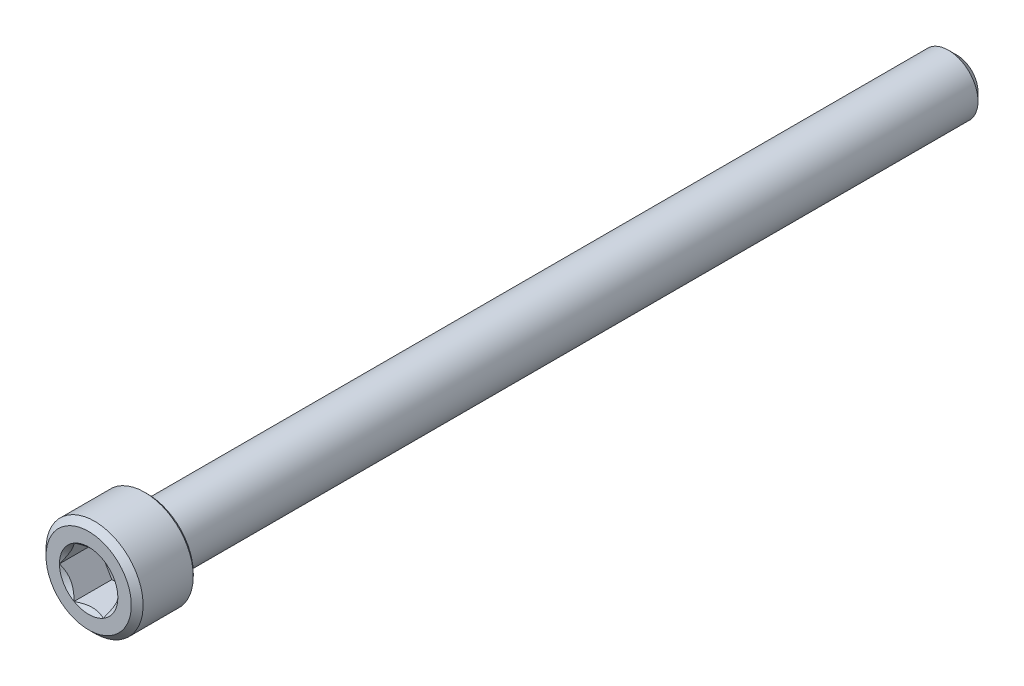
ISO-10303-21;
HEADER;
FILE_DESCRIPTION(('STEP AP214'),'2;1');
FILE_NAME('part.step','',(''),(''),'','','');
FILE_SCHEMA(('AUTOMOTIVE_DESIGN { 1 0 10303 214 1 1 1 1 }'));
ENDSEC;
DATA;
#1=APPLICATION_CONTEXT('core data for automotive mechanical design processes');
#2=APPLICATION_PROTOCOL_DEFINITION('international standard','automotive_design',2000,#1);
#3=PRODUCT_CONTEXT('',#1,'mechanical');
#4=PRODUCT('Part','Part','',(#3));
#5=PRODUCT_RELATED_PRODUCT_CATEGORY('part','',(#4));
#6=PRODUCT_DEFINITION_FORMATION('','',#4);
#7=PRODUCT_DEFINITION_CONTEXT('part definition',#1,'design');
#8=PRODUCT_DEFINITION('design','',#6,#7);
#9=PRODUCT_DEFINITION_SHAPE('','',#8);
#10=(LENGTH_UNIT() NAMED_UNIT(*) SI_UNIT(.MILLI.,.METRE.));
#11=(NAMED_UNIT(*) PLANE_ANGLE_UNIT() SI_UNIT($,.RADIAN.));
#12=(NAMED_UNIT(*) SI_UNIT($,.STERADIAN.) SOLID_ANGLE_UNIT());
#13=UNCERTAINTY_MEASURE_WITH_UNIT(LENGTH_MEASURE(1.E-05),#10,'distance_accuracy_value','');
#14=(GEOMETRIC_REPRESENTATION_CONTEXT(3) GLOBAL_UNCERTAINTY_ASSIGNED_CONTEXT((#13)) GLOBAL_UNIT_ASSIGNED_CONTEXT((#10,
#11,#12)) REPRESENTATION_CONTEXT('',''));
#15=CARTESIAN_POINT('',(0.,0.,0.));
#16=DIRECTION('',(0.,0.,1.));
#17=DIRECTION('',(1.,0.,0.));
#18=AXIS2_PLACEMENT_3D('',#15,#16,#17);
#19=CARTESIAN_POINT('',(0.,0.,58.6486));
#20=DIRECTION('',(0.,0.,1.));
#21=DIRECTION('',(1.,0.,0.));
#22=AXIS2_PLACEMENT_3D('',#19,#20,#21);
#23=PLANE('',#22);
#24=DIRECTION('',(0.5,-0.866025403784438,0.));
#25=VECTOR('',#24,1.);
#26=CARTESIAN_POINT('',(-2.06185637534076,0.,58.6486));
#27=LINE('',#26,#25);
#28=CARTESIAN_POINT('',(-2.06185637534076,0.,58.6486));
#29=VERTEX_POINT('',#28);
#30=CARTESIAN_POINT('',(-1.03092818767038,-1.78562,58.6486));
#31=VERTEX_POINT('',#30);
#32=EDGE_CURVE('E137',#29,#31,#27,.T.);
#33=ORIENTED_EDGE('',*,*,#32,.T.);
#34=DIRECTION('',(1.,0.,0.));
#35=VECTOR('',#34,1.);
#36=CARTESIAN_POINT('',(-1.03092818767038,-1.78562,58.6486));
#37=LINE('',#36,#35);
#38=CARTESIAN_POINT('',(1.03092818767038,-1.78562,58.6486));
#39=VERTEX_POINT('',#38);
#40=EDGE_CURVE('E97',#31,#39,#37,.T.);
#41=ORIENTED_EDGE('',*,*,#40,.T.);
#42=DIRECTION('',(0.5,0.866025403784439,0.));
#43=VECTOR('',#42,1.);
#44=CARTESIAN_POINT('',(1.03092818767038,-1.78562,58.6486));
#45=LINE('',#44,#43);
#46=CARTESIAN_POINT('',(2.06185637534076,0.,58.6486));
#47=VERTEX_POINT('',#46);
#48=EDGE_CURVE('E99',#39,#47,#45,.T.);
#49=ORIENTED_EDGE('',*,*,#48,.T.);
#50=DIRECTION('',(-0.5,0.866025403784439,0.));
#51=VECTOR('',#50,1.);
#52=CARTESIAN_POINT('',(2.06185637534076,0.,58.6486));
#53=LINE('',#52,#51);
#54=CARTESIAN_POINT('',(1.03092818767038,1.78562,58.6486));
#55=VERTEX_POINT('',#54);
#56=EDGE_CURVE('E100',#47,#55,#53,.T.);
#57=ORIENTED_EDGE('',*,*,#56,.T.);
#58=DIRECTION('',(-1.,0.,0.));
#59=VECTOR('',#58,1.);
#60=CARTESIAN_POINT('',(1.03092818767038,1.78562,58.6486));
#61=LINE('',#60,#59);
#62=CARTESIAN_POINT('',(-1.03092818767038,1.78562,58.6486));
#63=VERTEX_POINT('',#62);
#64=EDGE_CURVE('E82',#55,#63,#61,.T.);
#65=ORIENTED_EDGE('',*,*,#64,.T.);
#66=DIRECTION('',(-0.5,-0.866025403784439,0.));
#67=VECTOR('',#66,1.);
#68=CARTESIAN_POINT('',(-1.03092818767038,1.78562,58.6486));
#69=LINE('',#68,#67);
#70=EDGE_CURVE('E131',#63,#29,#69,.T.);
#71=ORIENTED_EDGE('',*,*,#70,.T.);
#72=EDGE_LOOP('',(#33,#41,#49,#57,#65,#71));
#73=FACE_BOUND('',#72,.T.);
#74=ADVANCED_FACE('F17',(#73),#23,.T.);
#75=CARTESIAN_POINT('',(2.06185637534076,0.,58.6486));
#76=DIRECTION('',(0.866025403784439,0.5,0.));
#77=DIRECTION('',(-0.5,0.866025403784439,0.));
#78=AXIS2_PLACEMENT_3D('',#75,#76,#77);
#79=PLANE('',#78);
#80=CARTESIAN_POINT('',(2.06185637532686,2.46058809715619E-11,61.315600000035));
#81=CARTESIAN_POINT('',(2.02642287006139,0.0613726314343141,61.2802004995492));
#82=CARTESIAN_POINT('',(1.99039691582119,0.123771414569363,61.2468804146496));
#83=CARTESIAN_POINT('',(1.91693629806115,0.251008936885034,61.1858727616442));
#84=CARTESIAN_POINT('',(1.8794946522501,0.315859769748806,61.1582191270846));
#85=CARTESIAN_POINT('',(1.80399541009906,0.446628293087391,61.1108482649396));
#86=CARTESIAN_POINT('',(1.76595703077494,0.512512698714332,61.091012004616));
#87=CARTESIAN_POINT('',(1.68904308953308,0.645731552755586,61.06045046778));
#88=CARTESIAN_POINT('',(1.65016987553725,0.713061934449866,61.0497023867868));
#89=CARTESIAN_POINT('',(1.58317010137488,0.829108947394733,61.0400045880717));
#90=CARTESIAN_POINT('',(1.55513003782551,0.877675762109708,61.0385694330786));
#91=CARTESIAN_POINT('',(1.49909578617972,0.974729932924314,61.0409903583297));
#92=CARTESIAN_POINT('',(1.47110161760578,1.02321725521003,61.0448482931989));
#93=CARTESIAN_POINT('',(1.41538537197085,1.11972062345672,61.0576340723688));
#94=CARTESIAN_POINT('',(1.38766354396324,1.16773623804458,61.0665661844708));
#95=CARTESIAN_POINT('',(1.33268389705545,1.26296377987108,61.0890154679446));
#96=CARTESIAN_POINT('',(1.3054263054066,1.31017531349884,61.1025348207317));
#97=CARTESIAN_POINT('',(1.23563624998381,1.43105523535416,61.1426550620773));
#98=CARTESIAN_POINT('',(1.19353588652658,1.5039752038792,61.1722754051387));
#99=CARTESIAN_POINT('',(1.13163053077275,1.61119842530546,61.222277162052));
#100=CARTESIAN_POINT('',(1.11122988524938,1.64653337985914,61.2398452543421));
#101=CARTESIAN_POINT('',(1.07080633250774,1.71654902703011,61.2765826683536));
#102=CARTESIAN_POINT('',(1.05078320288605,1.75123010486141,61.2957510087463));
#103=CARTESIAN_POINT('',(1.03092818768453,1.78561999997549,61.3156000000351));
#104=B_SPLINE_CURVE_WITH_KNOTS('',3,(#80,#81,#82,#83,#84,#85,#86,#87,#88,#89,#90,#91,#92,#93,
#94,#95,#96,#97,#98,#99,#100,#101,#102,#103),.UNSPECIFIED.,.F.,.F.,(4,2,2,2,2,2,2,2,2,2,2,4),
(0.,0.237814133066714,0.477013279259505,0.712414751807008,0.947223776243913,1.1152810435644,
1.28339721085563,1.45165498750267,1.61999288981406,1.88720880274993,2.02045430030195,
2.15361867891217),.UNSPECIFIED.);
#105=CARTESIAN_POINT('',(2.06185637531632,0.,61.3156000000248));
#106=VERTEX_POINT('',#105);
#107=CARTESIAN_POINT('',(1.03092818762858,1.78561999998774,61.3156000000177));
#108=VERTEX_POINT('',#107);
#109=EDGE_CURVE('E20',#106,#108,#104,.T.);
#110=ORIENTED_EDGE('',*,*,#109,.T.);
#111=DIRECTION('',(0.,0.,1.));
#112=VECTOR('',#111,1.);
#113=CARTESIAN_POINT('',(1.03092818767038,1.78562,58.6486));
#114=LINE('',#113,#112);
#115=EDGE_CURVE('E106',#108,#55,#114,.F.);
#116=ORIENTED_EDGE('',*,*,#115,.T.);
#117=ORIENTED_EDGE('',*,*,#56,.F.);
#118=DIRECTION('',(0.,0.,1.));
#119=VECTOR('',#118,1.);
#120=CARTESIAN_POINT('',(2.06185637534076,0.,58.6486));
#121=LINE('',#120,#119);
#122=EDGE_CURVE('E67',#47,#106,#121,.T.);
#123=ORIENTED_EDGE('',*,*,#122,.T.);
#124=EDGE_LOOP('',(#110,#116,#117,#123));
#125=FACE_BOUND('',#124,.T.);
#126=ADVANCED_FACE('F105',(#125),#79,.F.);
#127=CARTESIAN_POINT('',(1.03092818767038,-1.78562,58.6486));
#128=DIRECTION('',(0.866025403784439,-0.5,0.));
#129=DIRECTION('',(0.5,0.866025403784439,0.));
#130=AXIS2_PLACEMENT_3D('',#127,#128,#129);
#131=PLANE('',#130);
#132=CARTESIAN_POINT('',(1.03092818768474,-1.78561999997566,61.315600000035));
#133=CARTESIAN_POINT('',(1.06636169294991,-1.72424736856578,61.2802004995492));
#134=CARTESIAN_POINT('',(1.10238764719,-1.66184858543066,61.2468804146496));
#135=CARTESIAN_POINT('',(1.17584826494994,-1.53461106311494,61.1858727616442));
#136=CARTESIAN_POINT('',(1.21328991076102,-1.46976023025119,61.1582191270846));
#137=CARTESIAN_POINT('',(1.28878915291209,-1.33899170691261,61.1108482649396));
#138=CARTESIAN_POINT('',(1.3268275322362,-1.27310730128567,61.091012004616));
#139=CARTESIAN_POINT('',(1.40374147347805,-1.13988844724441,61.06045046778));
#140=CARTESIAN_POINT('',(1.44261468747389,-1.07255806555013,61.0497023867868));
#141=CARTESIAN_POINT('',(1.50961446163626,-0.956511052605265,61.0400045880717));
#142=CARTESIAN_POINT('',(1.53765452518563,-0.90794423789029,61.0385694330786));
#143=CARTESIAN_POINT('',(1.59368877683142,-0.810890067075683,61.0409903583297));
#144=CARTESIAN_POINT('',(1.62168294540536,-0.762402744789972,61.0448482931989));
#145=CARTESIAN_POINT('',(1.67739919104029,-0.66589937654328,61.0576340723688));
#146=CARTESIAN_POINT('',(1.7051210190479,-0.617883761955417,61.0665661844708));
#147=CARTESIAN_POINT('',(1.76010066595569,-0.522656220128922,61.0890154679446));
#148=CARTESIAN_POINT('',(1.78735825760454,-0.475444686501156,61.1025348207317));
#149=CARTESIAN_POINT('',(1.85714831302733,-0.354564764645841,61.1426550620773));
#150=CARTESIAN_POINT('',(1.89924867648456,-0.281644796120803,61.1722754051387));
#151=CARTESIAN_POINT('',(1.96115403223839,-0.174421574694534,61.222277162052));
#152=CARTESIAN_POINT('',(1.98155467776176,-0.13908662014086,61.2398452543421));
#153=CARTESIAN_POINT('',(2.0219782305034,-0.0690709729698903,61.2765826683536));
#154=CARTESIAN_POINT('',(2.04200136012509,-0.034389895138592,61.2957510087463));
#155=CARTESIAN_POINT('',(2.06185637532661,-2.45045778072544E-11,61.3156000000351));
#156=B_SPLINE_CURVE_WITH_KNOTS('',3,(#132,#133,#134,#135,#136,#137,#138,#139,#140,#141,#142,
#143,#144,#145,#146,#147,#148,#149,#150,#151,#152,#153,#154,#155),.UNSPECIFIED.,.F.,.F.,(4,2,2,
2,2,2,2,2,2,2,2,4),(0.,0.237814133066714,0.477013279259507,0.712414751807009,0.947223776243916,
1.1152810435644,1.28339721085563,1.45165498750268,1.61999288981406,1.88720880274993,
2.02045430030195,2.15361867891217),.UNSPECIFIED.);
#157=CARTESIAN_POINT('',(1.03092818765816,-1.78561999997884,61.3156000000248));
#158=VERTEX_POINT('',#157);
#159=EDGE_CURVE('E111',#158,#106,#156,.T.);
#160=ORIENTED_EDGE('',*,*,#159,.T.);
#161=ORIENTED_EDGE('',*,*,#122,.F.);
#162=ORIENTED_EDGE('',*,*,#48,.F.);
#163=DIRECTION('',(0.,0.,-1.));
#164=VECTOR('',#163,1.);
#165=CARTESIAN_POINT('',(1.03092818767038,-1.78562,58.6486));
#166=LINE('',#165,#164);
#167=EDGE_CURVE('E116',#39,#158,#166,.F.);
#168=ORIENTED_EDGE('',*,*,#167,.T.);
#169=EDGE_LOOP('',(#160,#161,#162,#168));
#170=FACE_BOUND('',#169,.T.);
#171=ADVANCED_FACE('F109',(#170),#131,.F.);
#172=CARTESIAN_POINT('',(-1.03092818767038,-1.78562,58.6486));
#173=DIRECTION('',(0.,-1.,0.));
#174=DIRECTION('',(0.,0.,-1.));
#175=AXIS2_PLACEMENT_3D('',#172,#173,#174);
#176=PLANE('',#175);
#177=CARTESIAN_POINT('',(-1.03092818764212,-1.78562000000026,61.315600000035));
#178=CARTESIAN_POINT('',(-0.96006117711148,-1.78562000000009,61.2802004995492));
#179=CARTESIAN_POINT('',(-0.888009268631189,-1.78562000000003,61.2468804146496));
#180=CARTESIAN_POINT('',(-0.741088033111212,-1.78561999999997,61.1858727616442));
#181=CARTESIAN_POINT('',(-0.666204741489083,-1.78561999999999,61.1582191270846));
#182=CARTESIAN_POINT('',(-0.515206257186968,-1.78562000000001,61.1108482649396));
#183=CARTESIAN_POINT('',(-0.439129498538739,-1.78562,61.091012004616));
#184=CARTESIAN_POINT('',(-0.285301616055034,-1.78562,61.06045046778));
#185=CARTESIAN_POINT('',(-0.207555188063369,-1.78562,61.0497023867868));
#186=CARTESIAN_POINT('',(-0.0735556397386277,-1.78562,61.0400045880717));
#187=CARTESIAN_POINT('',(-0.0174755126398806,-1.78562,61.0385694330786));
#188=CARTESIAN_POINT('',(0.0945929906516976,-1.78562,61.0409903583297));
#189=CARTESIAN_POINT('',(0.150581327799577,-1.78562,61.0448482931989));
#190=CARTESIAN_POINT('',(0.262013819069443,-1.78562,61.0576340723688));
#191=CARTESIAN_POINT('',(0.31745747508466,-1.78562,61.0665661844708));
#192=CARTESIAN_POINT('',(0.427416768900246,-1.78562,61.0890154679446));
#193=CARTESIAN_POINT('',(0.481931952197938,-1.78562,61.1025348207317));
#194=CARTESIAN_POINT('',(0.621512063043512,-1.78562,61.1426550620773));
#195=CARTESIAN_POINT('',(0.705712789957971,-1.78562,61.1722754051387));
#196=CARTESIAN_POINT('',(0.829523501465641,-1.78562,61.222277162052));
#197=CARTESIAN_POINT('',(0.870324792512375,-1.78562,61.2398452543421));
#198=CARTESIAN_POINT('',(0.951171897995666,-1.78562,61.2765826683536));
#199=CARTESIAN_POINT('',(0.991218157239039,-1.78562,61.2957510087463));
#200=CARTESIAN_POINT('',(1.03092818764208,-1.78562,61.3156000000351));
#201=B_SPLINE_CURVE_WITH_KNOTS('',3,(#177,#178,#179,#180,#181,#182,#183,#184,#185,#186,#187,
#188,#189,#190,#191,#192,#193,#194,#195,#196,#197,#198,#199,#200),.UNSPECIFIED.,.F.,.F.,(4,2,2,
2,2,2,2,2,2,2,2,4),(0.,0.237814133066714,0.477013279259505,0.712414751807006,0.947223776243912,
1.1152810435644,1.28339721085563,1.45165498750267,1.61999288981406,1.88720880274993,
2.02045430030195,2.15361867891217),.UNSPECIFIED.);
#202=CARTESIAN_POINT('',(-1.03092818765816,-1.78561999997884,61.3156000000248));
#203=VERTEX_POINT('',#202);
#204=EDGE_CURVE('E235',#203,#158,#201,.T.);
#205=ORIENTED_EDGE('',*,*,#204,.T.);
#206=ORIENTED_EDGE('',*,*,#167,.F.);
#207=ORIENTED_EDGE('',*,*,#40,.F.);
#208=DIRECTION('',(0.,0.,1.));
#209=VECTOR('',#208,1.);
#210=CARTESIAN_POINT('',(-1.03092818767038,-1.78562,58.6486));
#211=LINE('',#210,#209);
#212=EDGE_CURVE('E134',#31,#203,#211,.T.);
#213=ORIENTED_EDGE('',*,*,#212,.T.);
#214=EDGE_LOOP('',(#205,#206,#207,#213));
#215=FACE_BOUND('',#214,.T.);
#216=ADVANCED_FACE('F245',(#215),#176,.F.);
#217=CARTESIAN_POINT('',(-2.06185637534076,0.,58.6486));
#218=DIRECTION('',(-0.866025403784438,-0.5,0.));
#219=DIRECTION('',(0.5,-0.866025403784438,0.));
#220=AXIS2_PLACEMENT_3D('',#217,#218,#219);
#221=PLANE('',#220);
#222=CARTESIAN_POINT('',(-2.06185637532686,-2.46050422287079E-11,61.315600000035));
#223=CARTESIAN_POINT('',(-2.02642287006139,-0.0613726314343138,61.2802004995492));
#224=CARTESIAN_POINT('',(-1.99039691582119,-0.123771414569363,61.2468804146496));
#225=CARTESIAN_POINT('',(-1.91693629806115,-0.251008936885035,61.1858727616442));
#226=CARTESIAN_POINT('',(-1.8794946522501,-0.315859769748807,61.1582191270846));
#227=CARTESIAN_POINT('',(-1.80399541009906,-0.446628293087392,61.1108482649396));
#228=CARTESIAN_POINT('',(-1.76595703077494,-0.512512698714332,61.091012004616));
#229=CARTESIAN_POINT('',(-1.68904308953308,-0.645731552755585,61.06045046778));
#230=CARTESIAN_POINT('',(-1.65016987553725,-0.713061934449865,61.0497023867868));
#231=CARTESIAN_POINT('',(-1.58317010137488,-0.829108947394732,61.0400045880717));
#232=CARTESIAN_POINT('',(-1.55513003782551,-0.877675762109706,61.0385694330786));
#233=CARTESIAN_POINT('',(-1.49909578617972,-0.974729932924313,61.0409903583297));
#234=CARTESIAN_POINT('',(-1.47110161760578,-1.02321725521002,61.0448482931989));
#235=CARTESIAN_POINT('',(-1.41538537197085,-1.11972062345672,61.0576340723688));
#236=CARTESIAN_POINT('',(-1.38766354396324,-1.16773623804458,61.0665661844708));
#237=CARTESIAN_POINT('',(-1.33268389705545,-1.26296377987107,61.0890154679446));
#238=CARTESIAN_POINT('',(-1.3054263054066,-1.31017531349884,61.1025348207317));
#239=CARTESIAN_POINT('',(-1.23563624998381,-1.43105523535416,61.1426550620773));
#240=CARTESIAN_POINT('',(-1.19353588652658,-1.50397520387919,61.1722754051387));
#241=CARTESIAN_POINT('',(-1.13163053077275,-1.61119842530546,61.222277162052));
#242=CARTESIAN_POINT('',(-1.11122988524938,-1.64653337985914,61.2398452543421));
#243=CARTESIAN_POINT('',(-1.07080633250773,-1.71654902703011,61.2765826683536));
#244=CARTESIAN_POINT('',(-1.05078320288605,-1.75123010486141,61.2957510087463));
#245=CARTESIAN_POINT('',(-1.03092818768453,-1.78561999997549,61.3156000000351));
#246=B_SPLINE_CURVE_WITH_KNOTS('',3,(#222,#223,#224,#225,#226,#227,#228,#229,#230,#231,#232,
#233,#234,#235,#236,#237,#238,#239,#240,#241,#242,#243,#244,#245),.UNSPECIFIED.,.F.,.F.,(4,2,2,
2,2,2,2,2,2,2,2,4),(0.,0.237814133066715,0.477013279259507,0.712414751807007,0.947223776243913,
1.1152810435644,1.28339721085563,1.45165498750267,1.61999288981406,1.88720880274993,
2.02045430030195,2.15361867891217),.UNSPECIFIED.);
#247=CARTESIAN_POINT('',(-2.06185637531632,0.,61.3156000000248));
#248=VERTEX_POINT('',#247);
#249=EDGE_CURVE('E226',#248,#203,#246,.T.);
#250=ORIENTED_EDGE('',*,*,#249,.T.);
#251=ORIENTED_EDGE('',*,*,#212,.F.);
#252=ORIENTED_EDGE('',*,*,#32,.F.);
#253=DIRECTION('',(0.,0.,1.));
#254=VECTOR('',#253,1.);
#255=CARTESIAN_POINT('',(-2.06185637534076,0.,58.6486));
#256=LINE('',#255,#254);
#257=EDGE_CURVE('E128',#29,#248,#256,.T.);
#258=ORIENTED_EDGE('',*,*,#257,.T.);
#259=EDGE_LOOP('',(#250,#251,#252,#258));
#260=FACE_BOUND('',#259,.T.);
#261=ADVANCED_FACE('F241',(#260),#221,.F.);
#262=CARTESIAN_POINT('',(-1.03092818767038,1.78562,58.6486));
#263=DIRECTION('',(-0.866025403784439,0.5,0.));
#264=DIRECTION('',(-0.5,-0.866025403784439,0.));
#265=AXIS2_PLACEMENT_3D('',#262,#263,#264);
#266=PLANE('',#265);
#267=CARTESIAN_POINT('',(-1.03092818768474,1.78561999997566,61.315600000035));
#268=CARTESIAN_POINT('',(-1.06636169294991,1.72424736856578,61.2802004995492));
#269=CARTESIAN_POINT('',(-1.10238764719,1.66184858543066,61.2468804146496));
#270=CARTESIAN_POINT('',(-1.17584826494994,1.53461106311494,61.1858727616442));
#271=CARTESIAN_POINT('',(-1.21328991076102,1.46976023025119,61.1582191270846));
#272=CARTESIAN_POINT('',(-1.28878915291209,1.33899170691262,61.1108482649396));
#273=CARTESIAN_POINT('',(-1.3268275322362,1.27310730128567,61.091012004616));
#274=CARTESIAN_POINT('',(-1.40374147347805,1.13988844724441,61.06045046778));
#275=CARTESIAN_POINT('',(-1.44261468747388,1.07255806555013,61.0497023867868));
#276=CARTESIAN_POINT('',(-1.50961446163626,0.956511052605269,61.0400045880717));
#277=CARTESIAN_POINT('',(-1.53765452518563,0.907944237890293,61.0385694330786));
#278=CARTESIAN_POINT('',(-1.59368877683142,0.810890067075687,61.0409903583297));
#279=CARTESIAN_POINT('',(-1.62168294540536,0.762402744789975,61.0448482931989));
#280=CARTESIAN_POINT('',(-1.67739919104029,0.665899376543284,61.0576340723688));
#281=CARTESIAN_POINT('',(-1.7051210190479,0.61788376195542,61.0665661844708));
#282=CARTESIAN_POINT('',(-1.76010066595569,0.522656220128925,61.0890154679446));
#283=CARTESIAN_POINT('',(-1.78735825760454,0.475444686501159,61.1025348207317));
#284=CARTESIAN_POINT('',(-1.85714831302732,0.354564764645844,61.1426550620773));
#285=CARTESIAN_POINT('',(-1.89924867648456,0.281644796120805,61.1722754051387));
#286=CARTESIAN_POINT('',(-1.96115403223839,0.174421574694537,61.222277162052));
#287=CARTESIAN_POINT('',(-1.98155467776176,0.139086620140862,61.2398452543421));
#288=CARTESIAN_POINT('',(-2.0219782305034,0.069070972969892,61.2765826683536));
#289=CARTESIAN_POINT('',(-2.04200136012509,0.0343898951385935,61.2957510087463));
#290=CARTESIAN_POINT('',(-2.06185637532661,2.45060296928635E-11,61.3156000000351));
#291=B_SPLINE_CURVE_WITH_KNOTS('',3,(#267,#268,#269,#270,#271,#272,#273,#274,#275,#276,#277,
#278,#279,#280,#281,#282,#283,#284,#285,#286,#287,#288,#289,#290),.UNSPECIFIED.,.F.,.F.,(4,2,2,
2,2,2,2,2,2,2,2,4),(0.,0.237814133066714,0.477013279259505,0.712414751807006,0.947223776243912,
1.1152810435644,1.28339721085563,1.45165498750267,1.61999288981406,1.88720880274993,
2.02045430030195,2.15361867891217),.UNSPECIFIED.);
#292=CARTESIAN_POINT('',(-1.03092818765816,1.78561999997884,61.3156000000248));
#293=VERTEX_POINT('',#292);
#294=EDGE_CURVE('E196',#293,#248,#291,.T.);
#295=ORIENTED_EDGE('',*,*,#294,.T.);
#296=ORIENTED_EDGE('',*,*,#257,.F.);
#297=ORIENTED_EDGE('',*,*,#70,.F.);
#298=DIRECTION('',(0.,0.,1.));
#299=VECTOR('',#298,1.);
#300=CARTESIAN_POINT('',(-1.03092818767038,1.78562,58.6486));
#301=LINE('',#300,#299);
#302=EDGE_CURVE('E45',#63,#293,#301,.T.);
#303=ORIENTED_EDGE('',*,*,#302,.T.);
#304=EDGE_LOOP('',(#295,#296,#297,#303));
#305=FACE_BOUND('',#304,.T.);
#306=ADVANCED_FACE('F244',(#305),#266,.F.);
#307=CARTESIAN_POINT('',(1.03092818767038,1.78562,58.6486));
#308=DIRECTION('',(0.,1.,0.));
#309=DIRECTION('',(-1.,0.,0.));
#310=AXIS2_PLACEMENT_3D('',#307,#308,#309);
#311=PLANE('',#310);
#312=CARTESIAN_POINT('',(1.03092818764212,1.78562000000026,61.315600000035));
#313=CARTESIAN_POINT('',(0.96006117711148,1.78562000000009,61.2802004995492));
#314=CARTESIAN_POINT('',(0.888009268631189,1.78562000000003,61.2468804146496));
#315=CARTESIAN_POINT('',(0.741088033111212,1.78561999999997,61.1858727616442));
#316=CARTESIAN_POINT('',(0.666204741489083,1.78561999999999,61.1582191270846));
#317=CARTESIAN_POINT('',(0.515206257186968,1.78562000000001,61.1108482649396));
#318=CARTESIAN_POINT('',(0.43912949853874,1.78562,61.091012004616));
#319=CARTESIAN_POINT('',(0.285301616055035,1.78562,61.06045046778));
#320=CARTESIAN_POINT('',(0.207555188063369,1.78562,61.0497023867868));
#321=CARTESIAN_POINT('',(0.0735556397386276,1.78562,61.0400045880717));
#322=CARTESIAN_POINT('',(0.0174755126398805,1.78562,61.0385694330786));
#323=CARTESIAN_POINT('',(-0.0945929906516977,1.78562,61.0409903583297));
#324=CARTESIAN_POINT('',(-0.150581327799577,1.78562,61.0448482931989));
#325=CARTESIAN_POINT('',(-0.262013819069443,1.78562,61.0576340723688));
#326=CARTESIAN_POINT('',(-0.31745747508466,1.78562,61.0665661844708));
#327=CARTESIAN_POINT('',(-0.427416768900246,1.78562,61.0890154679446));
#328=CARTESIAN_POINT('',(-0.481931952197938,1.78562,61.1025348207317));
#329=CARTESIAN_POINT('',(-0.621512063043512,1.78562,61.1426550620773));
#330=CARTESIAN_POINT('',(-0.705712789957971,1.78562,61.1722754051387));
#331=CARTESIAN_POINT('',(-0.829523501465641,1.78562,61.222277162052));
#332=CARTESIAN_POINT('',(-0.870324792512375,1.78562,61.2398452543421));
#333=CARTESIAN_POINT('',(-0.951171897995666,1.78562,61.2765826683536));
#334=CARTESIAN_POINT('',(-0.991218157239039,1.78562,61.2957510087463));
#335=CARTESIAN_POINT('',(-1.03092818764208,1.78562,61.3156000000351));
#336=B_SPLINE_CURVE_WITH_KNOTS('',3,(#312,#313,#314,#315,#316,#317,#318,#319,#320,#321,#322,
#323,#324,#325,#326,#327,#328,#329,#330,#331,#332,#333,#334,#335),.UNSPECIFIED.,.F.,.F.,(4,2,2,
2,2,2,2,2,2,2,2,4),(0.,0.237814133066714,0.477013279259505,0.712414751807006,0.947223776243913,
1.1152810435644,1.28339721085563,1.45165498750267,1.61999288981406,1.88720880274993,
2.02045430030195,2.15361867891217),.UNSPECIFIED.);
#337=EDGE_CURVE('E187',#108,#293,#336,.T.);
#338=ORIENTED_EDGE('',*,*,#337,.T.);
#339=ORIENTED_EDGE('',*,*,#302,.F.);
#340=ORIENTED_EDGE('',*,*,#64,.F.);
#341=ORIENTED_EDGE('',*,*,#115,.F.);
#342=EDGE_LOOP('',(#338,#339,#340,#341));
#343=FACE_BOUND('',#342,.T.);
#344=ADVANCED_FACE('F204',(#343),#311,.F.);
#345=CARTESIAN_POINT('',(0.,0.,61.3156000000004));
#346=DIRECTION('',(0.,0.,1.));
#347=DIRECTION('',(1.,0.,0.));
#348=AXIS2_PLACEMENT_3D('',#345,#346,#347);
#349=CONICAL_SURFACE('',#348,2.06185637529188,0.785398163397448);
#350=ORIENTED_EDGE('',*,*,#109,.F.);
#351=CARTESIAN_POINT('',(0.,0.,61.3156000000004));
#352=DIRECTION('',(0.,0.,1.));
#353=DIRECTION('',(1.,0.,0.));
#354=AXIS2_PLACEMENT_3D('',#351,#352,#353);
#355=CIRCLE('',#354,2.06185637529188);
#356=EDGE_CURVE('E183',#108,#106,#355,.F.);
#357=ORIENTED_EDGE('',*,*,#356,.F.);
#358=EDGE_LOOP('',(#350,#357));
#359=FACE_BOUND('',#358,.T.);
#360=ADVANCED_FACE('F263',(#359),#349,.F.);
#361=CARTESIAN_POINT('',(0.,0.,61.3156000000004));
#362=DIRECTION('',(0.,0.,1.));
#363=DIRECTION('',(1.,0.,0.));
#364=AXIS2_PLACEMENT_3D('',#361,#362,#363);
#365=CONICAL_SURFACE('',#364,2.06185637529188,0.785398163397448);
#366=ORIENTED_EDGE('',*,*,#159,.F.);
#367=CARTESIAN_POINT('',(0.,0.,61.3156000000004));
#368=DIRECTION('',(0.,0.,1.));
#369=DIRECTION('',(1.,0.,0.));
#370=AXIS2_PLACEMENT_3D('',#367,#368,#369);
#371=CIRCLE('',#370,2.06185637529188);
#372=EDGE_CURVE('E179',#106,#158,#371,.F.);
#373=ORIENTED_EDGE('',*,*,#372,.F.);
#374=EDGE_LOOP('',(#366,#373));
#375=FACE_BOUND('',#374,.T.);
#376=ADVANCED_FACE('F260',(#375),#365,.F.);
#377=CARTESIAN_POINT('',(0.,0.,61.3156000000004));
#378=DIRECTION('',(0.,0.,1.));
#379=DIRECTION('',(1.,0.,0.));
#380=AXIS2_PLACEMENT_3D('',#377,#378,#379);
#381=CONICAL_SURFACE('',#380,2.06185637529188,0.785398163397448);
#382=ORIENTED_EDGE('',*,*,#204,.F.);
#383=CARTESIAN_POINT('',(0.,0.,61.3156000000004));
#384=DIRECTION('',(0.,0.,1.));
#385=DIRECTION('',(1.,0.,0.));
#386=AXIS2_PLACEMENT_3D('',#383,#384,#385);
#387=CIRCLE('',#386,2.06185637529188);
#388=EDGE_CURVE('E175',#158,#203,#387,.F.);
#389=ORIENTED_EDGE('',*,*,#388,.F.);
#390=EDGE_LOOP('',(#382,#389));
#391=FACE_BOUND('',#390,.T.);
#392=ADVANCED_FACE('F222',(#391),#381,.F.);
#393=CARTESIAN_POINT('',(0.,0.,61.3156000000004));
#394=DIRECTION('',(0.,0.,1.));
#395=DIRECTION('',(1.,0.,0.));
#396=AXIS2_PLACEMENT_3D('',#393,#394,#395);
#397=CONICAL_SURFACE('',#396,2.06185637529188,0.785398163397448);
#398=ORIENTED_EDGE('',*,*,#249,.F.);
#399=CARTESIAN_POINT('',(0.,0.,61.3156000000004));
#400=DIRECTION('',(0.,0.,1.));
#401=DIRECTION('',(1.,0.,0.));
#402=AXIS2_PLACEMENT_3D('',#399,#400,#401);
#403=CIRCLE('',#402,2.06185637529188);
#404=EDGE_CURVE('E171',#203,#248,#403,.F.);
#405=ORIENTED_EDGE('',*,*,#404,.F.);
#406=EDGE_LOOP('',(#398,#405));
#407=FACE_BOUND('',#406,.T.);
#408=ADVANCED_FACE('F217',(#407),#397,.F.);
#409=CARTESIAN_POINT('',(0.,0.,61.3156000000004));
#410=DIRECTION('',(0.,0.,1.));
#411=DIRECTION('',(1.,0.,0.));
#412=AXIS2_PLACEMENT_3D('',#409,#410,#411);
#413=CONICAL_SURFACE('',#412,2.06185637529188,0.785398163397448);
#414=ORIENTED_EDGE('',*,*,#294,.F.);
#415=CARTESIAN_POINT('',(0.,0.,61.3156000000004));
#416=DIRECTION('',(0.,0.,1.));
#417=DIRECTION('',(1.,0.,0.));
#418=AXIS2_PLACEMENT_3D('',#415,#416,#417);
#419=CIRCLE('',#418,2.06185637529188);
#420=EDGE_CURVE('E167',#248,#293,#419,.F.);
#421=ORIENTED_EDGE('',*,*,#420,.F.);
#422=EDGE_LOOP('',(#414,#421));
#423=FACE_BOUND('',#422,.T.);
#424=ADVANCED_FACE('F211',(#423),#413,.F.);
#425=CARTESIAN_POINT('',(0.,0.,61.3156000000004));
#426=DIRECTION('',(0.,0.,1.));
#427=DIRECTION('',(1.,0.,0.));
#428=AXIS2_PLACEMENT_3D('',#425,#426,#427);
#429=CONICAL_SURFACE('',#428,2.06185637529188,0.785398163397448);
#430=ORIENTED_EDGE('',*,*,#337,.F.);
#431=CARTESIAN_POINT('',(0.,0.,61.3156000000004));
#432=DIRECTION('',(0.,0.,1.));
#433=DIRECTION('',(1.,0.,0.));
#434=AXIS2_PLACEMENT_3D('',#431,#432,#433);
#435=CIRCLE('',#434,2.06185637529188);
#436=EDGE_CURVE('E163',#293,#108,#435,.F.);
#437=ORIENTED_EDGE('',*,*,#436,.F.);
#438=EDGE_LOOP('',(#430,#437));
#439=FACE_BOUND('',#438,.T.);
#440=ADVANCED_FACE('F206',(#439),#429,.F.);
#441=CARTESIAN_POINT('',(0.,0.,61.3156));
#442=DIRECTION('',(0.,0.,1.));
#443=DIRECTION('',(1.,0.,0.));
#444=AXIS2_PLACEMENT_3D('',#441,#442,#443);
#445=PLANE('',#444);
#446=CARTESIAN_POINT('',(0.,0.,61.3156000000004));
#447=DIRECTION('',(0.,0.,-1.));
#448=DIRECTION('',(-1.,0.,0.));
#449=AXIS2_PLACEMENT_3D('',#446,#447,#448);
#450=CIRCLE('',#449,3.01244000002043);
#451=CARTESIAN_POINT('',(-3.01244000002043,0.,61.3156000000004));
#452=VERTEX_POINT('',#451);
#453=EDGE_CURVE('E158',#452,#452,#450,.T.);
#454=ORIENTED_EDGE('',*,*,#453,.F.);
#455=EDGE_LOOP('',(#454));
#456=FACE_BOUND('',#455,.T.);
#457=ORIENTED_EDGE('',*,*,#420,.T.);
#458=ORIENTED_EDGE('',*,*,#436,.T.);
#459=ORIENTED_EDGE('',*,*,#356,.T.);
#460=ORIENTED_EDGE('',*,*,#372,.T.);
#461=ORIENTED_EDGE('',*,*,#388,.T.);
#462=ORIENTED_EDGE('',*,*,#404,.T.);
#463=EDGE_LOOP('',(#457,#458,#459,#460,#461,#462));
#464=FACE_BOUND('',#463,.T.);
#465=ADVANCED_FACE('F210',(#456,#464),#445,.T.);
#466=CARTESIAN_POINT('',(0.,0.,60.899040000038));
#467=DIRECTION('',(0.,0.,-1.));
#468=DIRECTION('',(-1.,0.,0.));
#469=AXIS2_PLACEMENT_3D('',#466,#467,#468);
#470=CONICAL_SURFACE('',#469,3.42900000003965,0.785398163465678);
#471=ORIENTED_EDGE('',*,*,#453,.T.);
#472=EDGE_LOOP('',(#471));
#473=FACE_BOUND('',#472,.T.);
#474=CARTESIAN_POINT('',(0.,0.,60.89904));
#475=DIRECTION('',(0.,0.,-1.));
#476=DIRECTION('',(-1.,0.,0.));
#477=AXIS2_PLACEMENT_3D('',#474,#475,#476);
#478=CIRCLE('',#477,3.429);
#479=CARTESIAN_POINT('',(-3.429,0.,60.89904));
#480=VERTEX_POINT('',#479);
#481=EDGE_CURVE('E162',#480,#480,#478,.T.);
#482=ORIENTED_EDGE('',*,*,#481,.F.);
#483=EDGE_LOOP('',(#482));
#484=FACE_BOUND('',#483,.T.);
#485=ADVANCED_FACE('F299',(#473,#484),#470,.T.);
#486=CARTESIAN_POINT('',(0.,0.,61.3156));
#487=DIRECTION('',(0.,0.,-1.));
#488=DIRECTION('',(-1.,0.,0.));
#489=AXIS2_PLACEMENT_3D('',#486,#487,#488);
#490=CYLINDRICAL_SURFACE('',#489,3.429);
#491=ORIENTED_EDGE('',*,*,#481,.T.);
#492=EDGE_LOOP('',(#491));
#493=FACE_BOUND('',#492,.T.);
#494=CARTESIAN_POINT('',(0.,0.,57.3582799999599));
#495=DIRECTION('',(0.,0.,1.));
#496=DIRECTION('',(1.,0.,0.));
#497=AXIS2_PLACEMENT_3D('',#494,#495,#496);
#498=CIRCLE('',#497,3.42899999992596);
#499=CARTESIAN_POINT('',(3.42899999992596,0.,57.3582799999599));
#500=VERTEX_POINT('',#499);
#501=EDGE_CURVE('E157',#500,#500,#498,.F.);
#502=ORIENTED_EDGE('',*,*,#501,.F.);
#503=EDGE_LOOP('',(#502));
#504=FACE_BOUND('',#503,.T.);
#505=ADVANCED_FACE('F296',(#493,#504),#490,.T.);
#506=CARTESIAN_POINT('',(0.,0.,57.3582799999031));
#507=DIRECTION('',(0.,0.,1.));
#508=DIRECTION('',(1.,0.,0.));
#509=AXIS2_PLACEMENT_3D('',#506,#507,#508);
#510=CONICAL_SURFACE('',#509,3.42899999986912,0.785398163397448);
#511=CARTESIAN_POINT('',(0.,0.,57.1499999999787));
#512=DIRECTION('',(0.,0.,1.));
#513=DIRECTION('',(1.,0.,0.));
#514=AXIS2_PLACEMENT_3D('',#511,#512,#513);
#515=CIRCLE('',#514,3.22071999994478);
#516=CARTESIAN_POINT('',(3.22071999994478,0.,57.1499999999787));
#517=VERTEX_POINT('',#516);
#518=EDGE_CURVE('E153',#517,#517,#515,.T.);
#519=ORIENTED_EDGE('',*,*,#518,.T.);
#520=EDGE_LOOP('',(#519));
#521=FACE_BOUND('',#520,.T.);
#522=ORIENTED_EDGE('',*,*,#501,.T.);
#523=EDGE_LOOP('',(#522));
#524=FACE_BOUND('',#523,.T.);
#525=ADVANCED_FACE('F292',(#521,#524),#510,.T.);
#526=CARTESIAN_POINT('',(0.,0.,0.));
#527=DIRECTION('',(0.,0.,1.));
#528=DIRECTION('',(1.,0.,0.));
#529=AXIS2_PLACEMENT_3D('',#526,#527,#528);
#530=PLANE('',#529);
#531=CARTESIAN_POINT('',(0.,0.,0.));
#532=DIRECTION('',(0.,0.,1.));
#533=DIRECTION('',(1.,0.,0.));
#534=AXIS2_PLACEMENT_3D('',#531,#532,#533);
#535=CIRCLE('',#534,1.48844000000281);
#536=CARTESIAN_POINT('',(1.48844000000281,0.,0.));
#537=VERTEX_POINT('',#536);
#538=EDGE_CURVE('E149',#537,#537,#535,.T.);
#539=ORIENTED_EDGE('',*,*,#538,.F.);
#540=EDGE_LOOP('',(#539));
#541=FACE_BOUND('',#540,.T.);
#542=ADVANCED_FACE('F288',(#541),#530,.F.);
#543=CARTESIAN_POINT('',(0.,0.,57.15));
#544=DIRECTION('',(0.,0.,1.));
#545=DIRECTION('',(1.,0.,0.));
#546=AXIS2_PLACEMENT_3D('',#543,#544,#545);
#547=PLANE('',#546);
#548=CARTESIAN_POINT('',(0.,0.,57.15));
#549=DIRECTION('',(0.,0.,-1.));
#550=DIRECTION('',(-1.,0.,0.));
#551=AXIS2_PLACEMENT_3D('',#548,#549,#550);
#552=CIRCLE('',#551,2.0828);
#553=CARTESIAN_POINT('',(-2.0828,0.,57.15));
#554=VERTEX_POINT('',#553);
#555=EDGE_CURVE('E32',#554,#554,#552,.T.);
#556=ORIENTED_EDGE('',*,*,#555,.F.);
#557=EDGE_LOOP('',(#556));
#558=FACE_BOUND('',#557,.T.);
#559=ORIENTED_EDGE('',*,*,#518,.F.);
#560=EDGE_LOOP('',(#559));
#561=FACE_BOUND('',#560,.T.);
#562=ADVANCED_FACE('F281',(#558,#561),#547,.F.);
#563=CARTESIAN_POINT('',(0.,0.,0.594359999979588));
#564=DIRECTION('',(0.,0.,1.));
#565=DIRECTION('',(1.,0.,0.));
#566=AXIS2_PLACEMENT_3D('',#563,#564,#565);
#567=CONICAL_SURFACE('',#566,2.0827999999824,0.785398163397448);
#568=CARTESIAN_POINT('',(0.,0.,0.594360000000009));
#569=DIRECTION('',(0.,0.,-1.));
#570=DIRECTION('',(-1.,0.,0.));
#571=AXIS2_PLACEMENT_3D('',#568,#569,#570);
#572=CIRCLE('',#571,2.0828);
#573=CARTESIAN_POINT('',(-2.0828,0.,0.594360000000009));
#574=VERTEX_POINT('',#573);
#575=EDGE_CURVE('E11',#574,#574,#572,.F.);
#576=ORIENTED_EDGE('',*,*,#575,.F.);
#577=EDGE_LOOP('',(#576));
#578=FACE_BOUND('',#577,.T.);
#579=ORIENTED_EDGE('',*,*,#538,.T.);
#580=EDGE_LOOP('',(#579));
#581=FACE_BOUND('',#580,.T.);
#582=ADVANCED_FACE('F275',(#578,#581),#567,.T.);
#583=CARTESIAN_POINT('',(0.,0.,57.15));
#584=DIRECTION('',(0.,0.,-1.));
#585=DIRECTION('',(-1.,0.,0.));
#586=AXIS2_PLACEMENT_3D('',#583,#584,#585);
#587=CYLINDRICAL_SURFACE('',#586,2.0828);
#588=ORIENTED_EDGE('',*,*,#575,.T.);
#589=EDGE_LOOP('',(#588));
#590=FACE_BOUND('',#589,.T.);
#591=ORIENTED_EDGE('',*,*,#555,.T.);
#592=EDGE_LOOP('',(#591));
#593=FACE_BOUND('',#592,.T.);
#594=ADVANCED_FACE('F273',(#590,#593),#587,.T.);
#595=CLOSED_SHELL('',(#74,#126,#171,#216,#261,#306,#344,#360,#376,#392,#408,#424,#440,#465,#485,
#505,#525,#542,#562,#582,#594));
#596=MANIFOLD_SOLID_BREP('B1',#595);
#597=ADVANCED_BREP_SHAPE_REPRESENTATION('',(#18,#596),#14);
#598=SHAPE_DEFINITION_REPRESENTATION(#9,#597);
ENDSEC;
END-ISO-10303-21;
